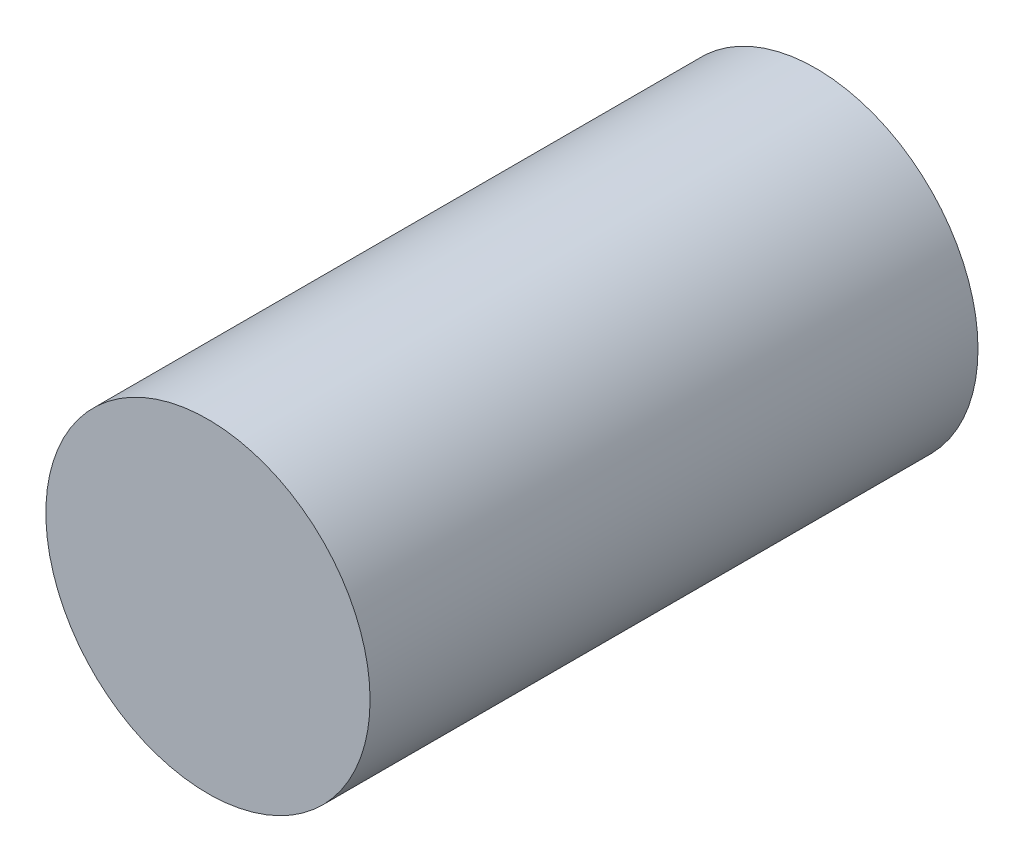
ISO-10303-21;
HEADER;
FILE_DESCRIPTION(('STEP AP214'),'2;1');
FILE_NAME('part.step','',(''),(''),'','','');
FILE_SCHEMA(('AUTOMOTIVE_DESIGN { 1 0 10303 214 1 1 1 1 }'));
ENDSEC;
DATA;
#1=APPLICATION_CONTEXT('core data for automotive mechanical design processes');
#2=APPLICATION_PROTOCOL_DEFINITION('international standard','automotive_design',2000,#1);
#3=PRODUCT_CONTEXT('',#1,'mechanical');
#4=PRODUCT('Part','Part','',(#3));
#5=PRODUCT_RELATED_PRODUCT_CATEGORY('part','',(#4));
#6=PRODUCT_DEFINITION_FORMATION('','',#4);
#7=PRODUCT_DEFINITION_CONTEXT('part definition',#1,'design');
#8=PRODUCT_DEFINITION('design','',#6,#7);
#9=PRODUCT_DEFINITION_SHAPE('','',#8);
#10=(LENGTH_UNIT() NAMED_UNIT(*) SI_UNIT(.MILLI.,.METRE.));
#11=(NAMED_UNIT(*) PLANE_ANGLE_UNIT() SI_UNIT($,.RADIAN.));
#12=(NAMED_UNIT(*) SI_UNIT($,.STERADIAN.) SOLID_ANGLE_UNIT());
#13=UNCERTAINTY_MEASURE_WITH_UNIT(LENGTH_MEASURE(1.E-05),#10,'distance_accuracy_value','');
#14=(GEOMETRIC_REPRESENTATION_CONTEXT(3) GLOBAL_UNCERTAINTY_ASSIGNED_CONTEXT((#13)) GLOBAL_UNIT_ASSIGNED_CONTEXT((#10,
#11,#12)) REPRESENTATION_CONTEXT('',''));
#15=CARTESIAN_POINT('',(0.,0.,0.));
#16=DIRECTION('',(0.,0.,1.));
#17=DIRECTION('',(1.,0.,0.));
#18=AXIS2_PLACEMENT_3D('',#15,#16,#17);
#19=CARTESIAN_POINT('',(0.,0.,75.));
#20=DIRECTION('',(0.,0.,-1.));
#21=DIRECTION('',(-1.,0.,0.));
#22=AXIS2_PLACEMENT_3D('',#19,#20,#21);
#23=CYLINDRICAL_SURFACE('',#22,20.);
#24=CARTESIAN_POINT('',(0.,0.,75.));
#25=DIRECTION('',(0.,0.,1.));
#26=DIRECTION('',(1.,0.,0.));
#27=AXIS2_PLACEMENT_3D('',#24,#25,#26);
#28=CIRCLE('',#27,20.);
#29=CARTESIAN_POINT('',(20.,0.,75.));
#30=VERTEX_POINT('',#29);
#31=EDGE_CURVE('E10',#30,#30,#28,.T.);
#32=ORIENTED_EDGE('',*,*,#31,.F.);
#33=EDGE_LOOP('',(#32));
#34=FACE_BOUND('',#33,.T.);
#35=CARTESIAN_POINT('',(0.,0.,0.));
#36=DIRECTION('',(0.,0.,1.));
#37=DIRECTION('',(1.,0.,0.));
#38=AXIS2_PLACEMENT_3D('',#35,#36,#37);
#39=CIRCLE('',#38,20.);
#40=CARTESIAN_POINT('',(20.,0.,0.));
#41=VERTEX_POINT('',#40);
#42=EDGE_CURVE('E34',#41,#41,#39,.T.);
#43=ORIENTED_EDGE('',*,*,#42,.T.);
#44=EDGE_LOOP('',(#43));
#45=FACE_BOUND('',#44,.T.);
#46=ADVANCED_FACE('F31',(#34,#45),#23,.T.);
#47=CARTESIAN_POINT('',(0.,0.,75.));
#48=DIRECTION('',(0.,0.,1.));
#49=DIRECTION('',(1.,0.,0.));
#50=AXIS2_PLACEMENT_3D('',#47,#48,#49);
#51=PLANE('',#50);
#52=ORIENTED_EDGE('',*,*,#31,.T.);
#53=EDGE_LOOP('',(#52));
#54=FACE_BOUND('',#53,.T.);
#55=ADVANCED_FACE('F46',(#54),#51,.T.);
#56=CARTESIAN_POINT('',(0.,0.,0.));
#57=DIRECTION('',(0.,0.,1.));
#58=DIRECTION('',(1.,0.,0.));
#59=AXIS2_PLACEMENT_3D('',#56,#57,#58);
#60=PLANE('',#59);
#61=ORIENTED_EDGE('',*,*,#42,.F.);
#62=EDGE_LOOP('',(#61));
#63=FACE_BOUND('',#62,.T.);
#64=ADVANCED_FACE('F44',(#63),#60,.F.);
#65=CLOSED_SHELL('',(#46,#55,#64));
#66=MANIFOLD_SOLID_BREP('B2',#65);
#67=ADVANCED_BREP_SHAPE_REPRESENTATION('',(#18,#66),#14);
#68=SHAPE_DEFINITION_REPRESENTATION(#9,#67);
ENDSEC;
END-ISO-10303-21;
